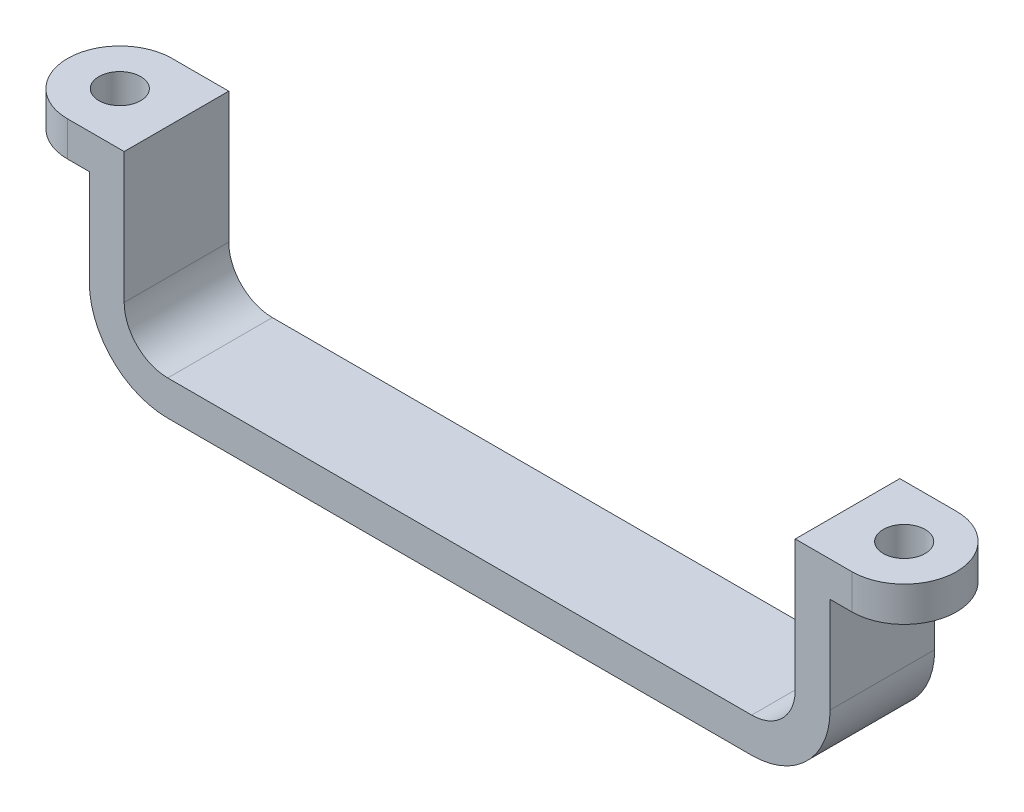
ISO-10303-21;
HEADER;
FILE_DESCRIPTION(('STEP AP214'),'2;1');
FILE_NAME('part.step','',(''),(''),'','','');
FILE_SCHEMA(('AUTOMOTIVE_DESIGN { 1 0 10303 214 1 1 1 1 }'));
ENDSEC;
DATA;
#1=APPLICATION_CONTEXT('core data for automotive mechanical design processes');
#2=APPLICATION_PROTOCOL_DEFINITION('international standard','automotive_design',2000,#1);
#3=PRODUCT_CONTEXT('',#1,'mechanical');
#4=PRODUCT('Part','Part','',(#3));
#5=PRODUCT_RELATED_PRODUCT_CATEGORY('part','',(#4));
#6=PRODUCT_DEFINITION_FORMATION('','',#4);
#7=PRODUCT_DEFINITION_CONTEXT('part definition',#1,'design');
#8=PRODUCT_DEFINITION('design','',#6,#7);
#9=PRODUCT_DEFINITION_SHAPE('','',#8);
#10=(LENGTH_UNIT() NAMED_UNIT(*) SI_UNIT(.MILLI.,.METRE.));
#11=(NAMED_UNIT(*) PLANE_ANGLE_UNIT() SI_UNIT($,.RADIAN.));
#12=(NAMED_UNIT(*) SI_UNIT($,.STERADIAN.) SOLID_ANGLE_UNIT());
#13=UNCERTAINTY_MEASURE_WITH_UNIT(LENGTH_MEASURE(1.E-05),#10,'distance_accuracy_value','');
#14=(GEOMETRIC_REPRESENTATION_CONTEXT(3) GLOBAL_UNCERTAINTY_ASSIGNED_CONTEXT((#13)) GLOBAL_UNIT_ASSIGNED_CONTEXT((#10,
#11,#12)) REPRESENTATION_CONTEXT('',''));
#15=CARTESIAN_POINT('',(0.,0.,0.));
#16=DIRECTION('',(0.,0.,1.));
#17=DIRECTION('',(1.,0.,0.));
#18=AXIS2_PLACEMENT_3D('',#15,#16,#17);
#19=CARTESIAN_POINT('',(21.25,10.,6.));
#20=DIRECTION('',(-1.,0.,0.));
#21=DIRECTION('',(0.,0.,1.));
#22=AXIS2_PLACEMENT_3D('',#19,#20,#21);
#23=PLANE('',#22);
#24=DIRECTION('',(0.,0.,-1.));
#25=VECTOR('',#24,1.);
#26=CARTESIAN_POINT('',(21.25,8.,0.));
#27=LINE('',#26,#25);
#28=CARTESIAN_POINT('',(21.25,8.,6.));
#29=VERTEX_POINT('',#28);
#30=CARTESIAN_POINT('',(21.25,8.,0.));
#31=VERTEX_POINT('',#30);
#32=EDGE_CURVE('E57',#29,#31,#27,.T.);
#33=ORIENTED_EDGE('',*,*,#32,.F.);
#34=DIRECTION('',(0.,1.,0.));
#35=VECTOR('',#34,1.);
#36=CARTESIAN_POINT('',(21.25,10.,6.));
#37=LINE('',#36,#35);
#38=CARTESIAN_POINT('',(21.25,2.5,6.));
#39=VERTEX_POINT('',#38);
#40=EDGE_CURVE('E265',#39,#29,#37,.T.);
#41=ORIENTED_EDGE('',*,*,#40,.F.);
#42=DIRECTION('',(0.,0.,-1.));
#43=VECTOR('',#42,1.);
#44=CARTESIAN_POINT('',(21.25,2.5,6.));
#45=LINE('',#44,#43);
#46=CARTESIAN_POINT('',(21.25,2.5,0.));
#47=VERTEX_POINT('',#46);
#48=EDGE_CURVE('E315',#39,#47,#45,.T.);
#49=ORIENTED_EDGE('',*,*,#48,.T.);
#50=DIRECTION('',(0.,1.,0.));
#51=VECTOR('',#50,1.);
#52=CARTESIAN_POINT('',(21.25,10.,0.));
#53=LINE('',#52,#51);
#54=EDGE_CURVE('E62',#47,#31,#53,.T.);
#55=ORIENTED_EDGE('',*,*,#54,.T.);
#56=EDGE_LOOP('',(#33,#41,#49,#55));
#57=FACE_BOUND('',#56,.T.);
#58=ADVANCED_FACE('F41',(#57),#23,.F.);
#59=CARTESIAN_POINT('',(-21.25,10.,6.));
#60=DIRECTION('',(1.,0.,0.));
#61=DIRECTION('',(0.,0.,-1.));
#62=AXIS2_PLACEMENT_3D('',#59,#60,#61);
#63=PLANE('',#62);
#64=DIRECTION('',(0.,0.,-1.));
#65=VECTOR('',#64,1.);
#66=CARTESIAN_POINT('',(-21.25,8.,0.));
#67=LINE('',#66,#65);
#68=CARTESIAN_POINT('',(-21.25,8.,6.));
#69=VERTEX_POINT('',#68);
#70=CARTESIAN_POINT('',(-21.25,8.,0.));
#71=VERTEX_POINT('',#70);
#72=EDGE_CURVE('E209',#69,#71,#67,.T.);
#73=ORIENTED_EDGE('',*,*,#72,.T.);
#74=DIRECTION('',(0.,-1.,0.));
#75=VECTOR('',#74,1.);
#76=CARTESIAN_POINT('',(-21.25,10.,0.));
#77=LINE('',#76,#75);
#78=CARTESIAN_POINT('',(-21.25,2.5,0.));
#79=VERTEX_POINT('',#78);
#80=EDGE_CURVE('E290',#71,#79,#77,.T.);
#81=ORIENTED_EDGE('',*,*,#80,.T.);
#82=DIRECTION('',(0.,0.,-1.));
#83=VECTOR('',#82,1.);
#84=CARTESIAN_POINT('',(-21.25,2.5,6.));
#85=LINE('',#84,#83);
#86=CARTESIAN_POINT('',(-21.25,2.5,6.));
#87=VERTEX_POINT('',#86);
#88=EDGE_CURVE('E326',#87,#79,#85,.T.);
#89=ORIENTED_EDGE('',*,*,#88,.F.);
#90=DIRECTION('',(0.,-1.,0.));
#91=VECTOR('',#90,1.);
#92=CARTESIAN_POINT('',(-21.25,10.,6.));
#93=LINE('',#92,#91);
#94=EDGE_CURVE('E253',#69,#87,#93,.T.);
#95=ORIENTED_EDGE('',*,*,#94,.F.);
#96=EDGE_LOOP('',(#73,#81,#89,#95));
#97=FACE_BOUND('',#96,.T.);
#98=ADVANCED_FACE('F373',(#97),#63,.F.);
#99=CARTESIAN_POINT('',(16.75,2.5,6.));
#100=DIRECTION('',(0.,0.,-1.));
#101=DIRECTION('',(-1.,0.,0.));
#102=AXIS2_PLACEMENT_3D('',#99,#100,#101);
#103=CYLINDRICAL_SURFACE('',#102,2.5);
#104=CARTESIAN_POINT('',(16.75,2.5,0.));
#105=DIRECTION('',(0.,0.,-1.));
#106=DIRECTION('',(1.,0.,0.));
#107=AXIS2_PLACEMENT_3D('',#104,#105,#106);
#108=CIRCLE('',#107,2.5);
#109=CARTESIAN_POINT('',(19.25,2.5,0.));
#110=VERTEX_POINT('',#109);
#111=CARTESIAN_POINT('',(16.75,0.,0.));
#112=VERTEX_POINT('',#111);
#113=EDGE_CURVE('E232',#110,#112,#108,.T.);
#114=ORIENTED_EDGE('',*,*,#113,.T.);
#115=DIRECTION('',(0.,0.,-1.));
#116=VECTOR('',#115,1.);
#117=CARTESIAN_POINT('',(16.75,0.,6.));
#118=LINE('',#117,#116);
#119=CARTESIAN_POINT('',(16.75,0.,6.));
#120=VERTEX_POINT('',#119);
#121=EDGE_CURVE('E11',#120,#112,#118,.T.);
#122=ORIENTED_EDGE('',*,*,#121,.F.);
#123=CARTESIAN_POINT('',(16.75,2.5,6.));
#124=DIRECTION('',(0.,0.,-1.));
#125=DIRECTION('',(1.,0.,0.));
#126=AXIS2_PLACEMENT_3D('',#123,#124,#125);
#127=CIRCLE('',#126,2.5);
#128=CARTESIAN_POINT('',(19.25,2.5,6.));
#129=VERTEX_POINT('',#128);
#130=EDGE_CURVE('E236',#129,#120,#127,.T.);
#131=ORIENTED_EDGE('',*,*,#130,.F.);
#132=DIRECTION('',(0.,0.,-1.));
#133=VECTOR('',#132,1.);
#134=CARTESIAN_POINT('',(19.25,2.5,6.));
#135=LINE('',#134,#133);
#136=EDGE_CURVE('E274',#129,#110,#135,.T.);
#137=ORIENTED_EDGE('',*,*,#136,.T.);
#138=EDGE_LOOP('',(#114,#122,#131,#137));
#139=FACE_BOUND('',#138,.T.);
#140=ADVANCED_FACE('F43',(#139),#103,.F.);
#141=CARTESIAN_POINT('',(-16.75,0.,6.));
#142=DIRECTION('',(0.,-1.,0.));
#143=DIRECTION('',(0.,0.,-1.));
#144=AXIS2_PLACEMENT_3D('',#141,#142,#143);
#145=PLANE('',#144);
#146=DIRECTION('',(-1.,0.,0.));
#147=VECTOR('',#146,1.);
#148=CARTESIAN_POINT('',(-16.75,0.,0.));
#149=LINE('',#148,#147);
#150=CARTESIAN_POINT('',(-16.75,0.,0.));
#151=VERTEX_POINT('',#150);
#152=EDGE_CURVE('E278',#112,#151,#149,.T.);
#153=ORIENTED_EDGE('',*,*,#152,.T.);
#154=DIRECTION('',(0.,0.,-1.));
#155=VECTOR('',#154,1.);
#156=CARTESIAN_POINT('',(-16.75,0.,6.));
#157=LINE('',#156,#155);
#158=CARTESIAN_POINT('',(-16.75,0.,6.));
#159=VERTEX_POINT('',#158);
#160=EDGE_CURVE('E50',#159,#151,#157,.T.);
#161=ORIENTED_EDGE('',*,*,#160,.F.);
#162=DIRECTION('',(-1.,0.,0.));
#163=VECTOR('',#162,1.);
#164=CARTESIAN_POINT('',(-16.75,0.,6.));
#165=LINE('',#164,#163);
#166=EDGE_CURVE('E240',#120,#159,#165,.T.);
#167=ORIENTED_EDGE('',*,*,#166,.F.);
#168=ORIENTED_EDGE('',*,*,#121,.T.);
#169=EDGE_LOOP('',(#153,#161,#167,#168));
#170=FACE_BOUND('',#169,.T.);
#171=ADVANCED_FACE('F408',(#170),#145,.F.);
#172=CARTESIAN_POINT('',(-16.75,2.5,6.));
#173=DIRECTION('',(0.,0.,-1.));
#174=DIRECTION('',(-1.,0.,0.));
#175=AXIS2_PLACEMENT_3D('',#172,#173,#174);
#176=CYLINDRICAL_SURFACE('',#175,2.5);
#177=CARTESIAN_POINT('',(-16.75,2.5,0.));
#178=DIRECTION('',(0.,0.,-1.));
#179=DIRECTION('',(1.,0.,0.));
#180=AXIS2_PLACEMENT_3D('',#177,#178,#179);
#181=CIRCLE('',#180,2.5);
#182=CARTESIAN_POINT('',(-19.25,2.5,0.));
#183=VERTEX_POINT('',#182);
#184=EDGE_CURVE('E281',#151,#183,#181,.T.);
#185=ORIENTED_EDGE('',*,*,#184,.T.);
#186=DIRECTION('',(0.,0.,-1.));
#187=VECTOR('',#186,1.);
#188=CARTESIAN_POINT('',(-19.25,2.5,6.));
#189=LINE('',#188,#187);
#190=CARTESIAN_POINT('',(-19.25,2.5,6.));
#191=VERTEX_POINT('',#190);
#192=EDGE_CURVE('E334',#191,#183,#189,.T.);
#193=ORIENTED_EDGE('',*,*,#192,.F.);
#194=CARTESIAN_POINT('',(-16.75,2.5,6.));
#195=DIRECTION('',(0.,0.,-1.));
#196=DIRECTION('',(1.,0.,0.));
#197=AXIS2_PLACEMENT_3D('',#194,#195,#196);
#198=CIRCLE('',#197,2.5);
#199=EDGE_CURVE('E244',#159,#191,#198,.T.);
#200=ORIENTED_EDGE('',*,*,#199,.F.);
#201=ORIENTED_EDGE('',*,*,#160,.T.);
#202=EDGE_LOOP('',(#185,#193,#200,#201));
#203=FACE_BOUND('',#202,.T.);
#204=ADVANCED_FACE('F343',(#203),#176,.F.);
#205=CARTESIAN_POINT('',(-19.25,10.,6.));
#206=DIRECTION('',(-1.,0.,0.));
#207=DIRECTION('',(0.,-1.,0.));
#208=AXIS2_PLACEMENT_3D('',#205,#206,#207);
#209=PLANE('',#208);
#210=DIRECTION('',(0.,1.,0.));
#211=VECTOR('',#210,1.);
#212=CARTESIAN_POINT('',(-19.25,10.,0.));
#213=LINE('',#212,#211);
#214=CARTESIAN_POINT('',(-19.25,10.,0.));
#215=VERTEX_POINT('',#214);
#216=EDGE_CURVE('E284',#183,#215,#213,.T.);
#217=ORIENTED_EDGE('',*,*,#216,.T.);
#218=DIRECTION('',(0.,0.,-1.));
#219=VECTOR('',#218,1.);
#220=CARTESIAN_POINT('',(-19.25,10.,6.));
#221=LINE('',#220,#219);
#222=CARTESIAN_POINT('',(-19.25,10.,6.));
#223=VERTEX_POINT('',#222);
#224=EDGE_CURVE('E330',#223,#215,#221,.T.);
#225=ORIENTED_EDGE('',*,*,#224,.F.);
#226=DIRECTION('',(0.,1.,0.));
#227=VECTOR('',#226,1.);
#228=CARTESIAN_POINT('',(-19.25,10.,6.));
#229=LINE('',#228,#227);
#230=EDGE_CURVE('E247',#191,#223,#229,.T.);
#231=ORIENTED_EDGE('',*,*,#230,.F.);
#232=ORIENTED_EDGE('',*,*,#192,.T.);
#233=EDGE_LOOP('',(#217,#225,#231,#232));
#234=FACE_BOUND('',#233,.T.);
#235=ADVANCED_FACE('F350',(#234),#209,.F.);
#236=CARTESIAN_POINT('',(-21.25,10.,6.));
#237=DIRECTION('',(0.,-1.,0.));
#238=DIRECTION('',(0.,0.,-1.));
#239=AXIS2_PLACEMENT_3D('',#236,#237,#238);
#240=PLANE('',#239);
#241=DIRECTION('',(-1.,0.,0.));
#242=VECTOR('',#241,1.);
#243=CARTESIAN_POINT('',(-21.25,10.,0.));
#244=LINE('',#243,#242);
#245=CARTESIAN_POINT('',(-22.5,10.,0.));
#246=VERTEX_POINT('',#245);
#247=EDGE_CURVE('E287',#215,#246,#244,.T.);
#248=ORIENTED_EDGE('',*,*,#247,.T.);
#249=CARTESIAN_POINT('',(-22.5,10.,3.));
#250=DIRECTION('',(0.,1.,0.));
#251=DIRECTION('',(0.,0.,1.));
#252=AXIS2_PLACEMENT_3D('',#249,#250,#251);
#253=CIRCLE('',#252,3.00000000000005);
#254=CARTESIAN_POINT('',(-22.5,10.,6.00000000000002));
#255=VERTEX_POINT('',#254);
#256=EDGE_CURVE('E199',#255,#246,#253,.F.);
#257=ORIENTED_EDGE('',*,*,#256,.F.);
#258=DIRECTION('',(-1.,0.,0.));
#259=VECTOR('',#258,1.);
#260=CARTESIAN_POINT('',(-21.25,10.,6.));
#261=LINE('',#260,#259);
#262=EDGE_CURVE('E250',#223,#255,#261,.T.);
#263=ORIENTED_EDGE('',*,*,#262,.F.);
#264=ORIENTED_EDGE('',*,*,#224,.T.);
#265=EDGE_LOOP('',(#248,#257,#263,#264));
#266=FACE_BOUND('',#265,.T.);
#267=CARTESIAN_POINT('',(-22.5,10.,3.));
#268=DIRECTION('',(0.,1.,0.));
#269=DIRECTION('',(0.,0.,1.));
#270=AXIS2_PLACEMENT_3D('',#267,#268,#269);
#271=CIRCLE('',#270,1.2);
#272=CARTESIAN_POINT('',(-22.5,10.,4.2));
#273=VERTEX_POINT('',#272);
#274=EDGE_CURVE('E206',#273,#273,#271,.F.);
#275=ORIENTED_EDGE('',*,*,#274,.T.);
#276=EDGE_LOOP('',(#275));
#277=FACE_BOUND('',#276,.T.);
#278=ADVANCED_FACE('F354',(#266,#277),#240,.F.);
#279=CARTESIAN_POINT('',(-16.75,2.5,6.));
#280=DIRECTION('',(0.,0.,-1.));
#281=DIRECTION('',(-1.,0.,0.));
#282=AXIS2_PLACEMENT_3D('',#279,#280,#281);
#283=CYLINDRICAL_SURFACE('',#282,4.5);
#284=CARTESIAN_POINT('',(-16.75,2.5,0.));
#285=DIRECTION('',(0.,0.,1.));
#286=DIRECTION('',(1.,0.,0.));
#287=AXIS2_PLACEMENT_3D('',#284,#285,#286);
#288=CIRCLE('',#287,4.5);
#289=CARTESIAN_POINT('',(-16.75,-2.,0.));
#290=VERTEX_POINT('',#289);
#291=EDGE_CURVE('E293',#79,#290,#288,.T.);
#292=ORIENTED_EDGE('',*,*,#291,.T.);
#293=DIRECTION('',(0.,0.,-1.));
#294=VECTOR('',#293,1.);
#295=CARTESIAN_POINT('',(-16.75,-2.,6.));
#296=LINE('',#295,#294);
#297=CARTESIAN_POINT('',(-16.75,-2.,6.));
#298=VERTEX_POINT('',#297);
#299=EDGE_CURVE('E322',#298,#290,#296,.T.);
#300=ORIENTED_EDGE('',*,*,#299,.F.);
#301=CARTESIAN_POINT('',(-16.75,2.5,6.));
#302=DIRECTION('',(0.,0.,1.));
#303=DIRECTION('',(1.,0.,0.));
#304=AXIS2_PLACEMENT_3D('',#301,#302,#303);
#305=CIRCLE('',#304,4.5);
#306=EDGE_CURVE('E256',#87,#298,#305,.T.);
#307=ORIENTED_EDGE('',*,*,#306,.F.);
#308=ORIENTED_EDGE('',*,*,#88,.T.);
#309=EDGE_LOOP('',(#292,#300,#307,#308));
#310=FACE_BOUND('',#309,.T.);
#311=ADVANCED_FACE('F376',(#310),#283,.T.);
#312=CARTESIAN_POINT('',(-16.75,-2.,6.));
#313=DIRECTION('',(0.,1.,0.));
#314=DIRECTION('',(0.,0.,1.));
#315=AXIS2_PLACEMENT_3D('',#312,#313,#314);
#316=PLANE('',#315);
#317=DIRECTION('',(1.,0.,0.));
#318=VECTOR('',#317,1.);
#319=CARTESIAN_POINT('',(-16.75,-2.,0.));
#320=LINE('',#319,#318);
#321=CARTESIAN_POINT('',(16.75,-2.,0.));
#322=VERTEX_POINT('',#321);
#323=EDGE_CURVE('E296',#290,#322,#320,.T.);
#324=ORIENTED_EDGE('',*,*,#323,.T.);
#325=DIRECTION('',(0.,0.,-1.));
#326=VECTOR('',#325,1.);
#327=CARTESIAN_POINT('',(16.75,-2.,6.));
#328=LINE('',#327,#326);
#329=CARTESIAN_POINT('',(16.75,-2.,6.));
#330=VERTEX_POINT('',#329);
#331=EDGE_CURVE('E318',#330,#322,#328,.T.);
#332=ORIENTED_EDGE('',*,*,#331,.F.);
#333=DIRECTION('',(1.,0.,0.));
#334=VECTOR('',#333,1.);
#335=CARTESIAN_POINT('',(-16.75,-2.,6.));
#336=LINE('',#335,#334);
#337=EDGE_CURVE('E259',#298,#330,#336,.T.);
#338=ORIENTED_EDGE('',*,*,#337,.F.);
#339=ORIENTED_EDGE('',*,*,#299,.T.);
#340=EDGE_LOOP('',(#324,#332,#338,#339));
#341=FACE_BOUND('',#340,.T.);
#342=ADVANCED_FACE('F381',(#341),#316,.F.);
#343=CARTESIAN_POINT('',(16.75,2.5,6.));
#344=DIRECTION('',(0.,0.,-1.));
#345=DIRECTION('',(-1.,0.,0.));
#346=AXIS2_PLACEMENT_3D('',#343,#344,#345);
#347=CYLINDRICAL_SURFACE('',#346,4.5);
#348=CARTESIAN_POINT('',(16.75,2.5,0.));
#349=DIRECTION('',(0.,0.,1.));
#350=DIRECTION('',(1.,0.,0.));
#351=AXIS2_PLACEMENT_3D('',#348,#349,#350);
#352=CIRCLE('',#351,4.5);
#353=EDGE_CURVE('E299',#322,#47,#352,.T.);
#354=ORIENTED_EDGE('',*,*,#353,.T.);
#355=ORIENTED_EDGE('',*,*,#48,.F.);
#356=CARTESIAN_POINT('',(16.75,2.5,6.));
#357=DIRECTION('',(0.,0.,1.));
#358=DIRECTION('',(1.,0.,0.));
#359=AXIS2_PLACEMENT_3D('',#356,#357,#358);
#360=CIRCLE('',#359,4.5);
#361=EDGE_CURVE('E262',#330,#39,#360,.T.);
#362=ORIENTED_EDGE('',*,*,#361,.F.);
#363=ORIENTED_EDGE('',*,*,#331,.T.);
#364=EDGE_LOOP('',(#354,#355,#362,#363));
#365=FACE_BOUND('',#364,.T.);
#366=ADVANCED_FACE('F385',(#365),#347,.T.);
#367=CARTESIAN_POINT('',(19.25,10.,6.));
#368=DIRECTION('',(0.,-1.,0.));
#369=DIRECTION('',(0.,0.,-1.));
#370=AXIS2_PLACEMENT_3D('',#367,#368,#369);
#371=PLANE('',#370);
#372=DIRECTION('',(-1.,0.,0.));
#373=VECTOR('',#372,1.);
#374=CARTESIAN_POINT('',(19.25,10.,0.));
#375=LINE('',#374,#373);
#376=CARTESIAN_POINT('',(22.5,10.,0.));
#377=VERTEX_POINT('',#376);
#378=CARTESIAN_POINT('',(19.25,10.,0.));
#379=VERTEX_POINT('',#378);
#380=EDGE_CURVE('E169',#377,#379,#375,.T.);
#381=ORIENTED_EDGE('',*,*,#380,.T.);
#382=DIRECTION('',(0.,0.,-1.));
#383=VECTOR('',#382,1.);
#384=CARTESIAN_POINT('',(19.25,10.,6.));
#385=LINE('',#384,#383);
#386=CARTESIAN_POINT('',(19.25,10.,6.));
#387=VERTEX_POINT('',#386);
#388=EDGE_CURVE('E311',#387,#379,#385,.T.);
#389=ORIENTED_EDGE('',*,*,#388,.F.);
#390=DIRECTION('',(-1.,0.,0.));
#391=VECTOR('',#390,1.);
#392=CARTESIAN_POINT('',(19.25,10.,6.));
#393=LINE('',#392,#391);
#394=CARTESIAN_POINT('',(22.5,10.,6.));
#395=VERTEX_POINT('',#394);
#396=EDGE_CURVE('E268',#395,#387,#393,.T.);
#397=ORIENTED_EDGE('',*,*,#396,.F.);
#398=CARTESIAN_POINT('',(22.5,10.,3.));
#399=DIRECTION('',(0.,1.,0.));
#400=DIRECTION('',(0.,0.,1.));
#401=AXIS2_PLACEMENT_3D('',#398,#399,#400);
#402=CIRCLE('',#401,3.);
#403=EDGE_CURVE('E185',#395,#377,#402,.T.);
#404=ORIENTED_EDGE('',*,*,#403,.T.);
#405=EDGE_LOOP('',(#381,#389,#397,#404));
#406=FACE_BOUND('',#405,.T.);
#407=CARTESIAN_POINT('',(22.5,10.,3.));
#408=DIRECTION('',(0.,1.,0.));
#409=DIRECTION('',(0.,0.,1.));
#410=AXIS2_PLACEMENT_3D('',#407,#408,#409);
#411=CIRCLE('',#410,1.2);
#412=CARTESIAN_POINT('',(22.5,10.,4.2));
#413=VERTEX_POINT('',#412);
#414=EDGE_CURVE('E192',#413,#413,#411,.T.);
#415=ORIENTED_EDGE('',*,*,#414,.F.);
#416=EDGE_LOOP('',(#415));
#417=FACE_BOUND('',#416,.T.);
#418=ADVANCED_FACE('F395',(#406,#417),#371,.F.);
#419=CARTESIAN_POINT('',(19.25,10.,6.));
#420=DIRECTION('',(1.,0.,0.));
#421=DIRECTION('',(0.,1.,0.));
#422=AXIS2_PLACEMENT_3D('',#419,#420,#421);
#423=PLANE('',#422);
#424=DIRECTION('',(0.,-1.,0.));
#425=VECTOR('',#424,1.);
#426=CARTESIAN_POINT('',(19.25,10.,0.));
#427=LINE('',#426,#425);
#428=EDGE_CURVE('E241',#379,#110,#427,.T.);
#429=ORIENTED_EDGE('',*,*,#428,.T.);
#430=ORIENTED_EDGE('',*,*,#136,.F.);
#431=DIRECTION('',(0.,-1.,0.));
#432=VECTOR('',#431,1.);
#433=CARTESIAN_POINT('',(19.25,10.,6.));
#434=LINE('',#433,#432);
#435=EDGE_CURVE('E271',#387,#129,#434,.T.);
#436=ORIENTED_EDGE('',*,*,#435,.F.);
#437=ORIENTED_EDGE('',*,*,#388,.T.);
#438=EDGE_LOOP('',(#429,#430,#436,#437));
#439=FACE_BOUND('',#438,.T.);
#440=ADVANCED_FACE('F418',(#439),#423,.F.);
#441=CARTESIAN_POINT('',(16.75,2.5,6.));
#442=DIRECTION('',(0.,0.,1.));
#443=DIRECTION('',(1.,0.,0.));
#444=AXIS2_PLACEMENT_3D('',#441,#442,#443);
#445=PLANE('',#444);
#446=ORIENTED_EDGE('',*,*,#130,.T.);
#447=ORIENTED_EDGE('',*,*,#166,.T.);
#448=ORIENTED_EDGE('',*,*,#199,.T.);
#449=ORIENTED_EDGE('',*,*,#230,.T.);
#450=ORIENTED_EDGE('',*,*,#262,.T.);
#451=DIRECTION('',(0.,1.,0.));
#452=VECTOR('',#451,1.);
#453=CARTESIAN_POINT('',(-22.5,8.,6.00000000000002));
#454=LINE('',#453,#452);
#455=CARTESIAN_POINT('',(-22.5,8.,6.00000000000002));
#456=VERTEX_POINT('',#455);
#457=EDGE_CURVE('E221',#456,#255,#454,.T.);
#458=ORIENTED_EDGE('',*,*,#457,.F.);
#459=DIRECTION('',(-1.,0.,0.));
#460=VECTOR('',#459,1.);
#461=CARTESIAN_POINT('',(0.,8.,6.));
#462=LINE('',#461,#460);
#463=EDGE_CURVE('E205',#69,#456,#462,.T.);
#464=ORIENTED_EDGE('',*,*,#463,.F.);
#465=ORIENTED_EDGE('',*,*,#94,.T.);
#466=ORIENTED_EDGE('',*,*,#306,.T.);
#467=ORIENTED_EDGE('',*,*,#337,.T.);
#468=ORIENTED_EDGE('',*,*,#361,.T.);
#469=ORIENTED_EDGE('',*,*,#40,.T.);
#470=DIRECTION('',(-1.,0.,0.));
#471=VECTOR('',#470,1.);
#472=CARTESIAN_POINT('',(0.,8.,6.));
#473=LINE('',#472,#471);
#474=CARTESIAN_POINT('',(22.5,8.,6.));
#475=VERTEX_POINT('',#474);
#476=EDGE_CURVE('E175',#475,#29,#473,.T.);
#477=ORIENTED_EDGE('',*,*,#476,.F.);
#478=DIRECTION('',(0.,1.,0.));
#479=VECTOR('',#478,1.);
#480=CARTESIAN_POINT('',(22.5,8.,6.));
#481=LINE('',#480,#479);
#482=EDGE_CURVE('E174',#475,#395,#481,.T.);
#483=ORIENTED_EDGE('',*,*,#482,.T.);
#484=ORIENTED_EDGE('',*,*,#396,.T.);
#485=ORIENTED_EDGE('',*,*,#435,.T.);
#486=EDGE_LOOP('',(#446,#447,#448,#449,#450,#458,#464,#465,#466,#467,#468,#469,#477,#483,#484,#485));
#487=FACE_BOUND('',#486,.T.);
#488=ADVANCED_FACE('F359',(#487),#445,.T.);
#489=CARTESIAN_POINT('',(16.75,2.5,0.));
#490=DIRECTION('',(0.,0.,1.));
#491=DIRECTION('',(1.,0.,0.));
#492=AXIS2_PLACEMENT_3D('',#489,#490,#491);
#493=PLANE('',#492);
#494=ORIENTED_EDGE('',*,*,#113,.F.);
#495=ORIENTED_EDGE('',*,*,#428,.F.);
#496=ORIENTED_EDGE('',*,*,#380,.F.);
#497=DIRECTION('',(0.,1.,0.));
#498=VECTOR('',#497,1.);
#499=CARTESIAN_POINT('',(22.5,8.,0.));
#500=LINE('',#499,#498);
#501=CARTESIAN_POINT('',(22.5,8.,0.));
#502=VERTEX_POINT('',#501);
#503=EDGE_CURVE('E165',#502,#377,#500,.T.);
#504=ORIENTED_EDGE('',*,*,#503,.F.);
#505=DIRECTION('',(1.,0.,0.));
#506=VECTOR('',#505,1.);
#507=CARTESIAN_POINT('',(0.,8.,0.));
#508=LINE('',#507,#506);
#509=EDGE_CURVE('E155',#31,#502,#508,.T.);
#510=ORIENTED_EDGE('',*,*,#509,.F.);
#511=ORIENTED_EDGE('',*,*,#54,.F.);
#512=ORIENTED_EDGE('',*,*,#353,.F.);
#513=ORIENTED_EDGE('',*,*,#323,.F.);
#514=ORIENTED_EDGE('',*,*,#291,.F.);
#515=ORIENTED_EDGE('',*,*,#80,.F.);
#516=DIRECTION('',(1.,0.,0.));
#517=VECTOR('',#516,1.);
#518=CARTESIAN_POINT('',(0.,8.,0.));
#519=LINE('',#518,#517);
#520=CARTESIAN_POINT('',(-22.5,8.,0.));
#521=VERTEX_POINT('',#520);
#522=EDGE_CURVE('E213',#521,#71,#519,.T.);
#523=ORIENTED_EDGE('',*,*,#522,.F.);
#524=DIRECTION('',(0.,1.,0.));
#525=VECTOR('',#524,1.);
#526=CARTESIAN_POINT('',(-22.5,8.,0.));
#527=LINE('',#526,#525);
#528=EDGE_CURVE('E228',#521,#246,#527,.T.);
#529=ORIENTED_EDGE('',*,*,#528,.T.);
#530=ORIENTED_EDGE('',*,*,#247,.F.);
#531=ORIENTED_EDGE('',*,*,#216,.F.);
#532=ORIENTED_EDGE('',*,*,#184,.F.);
#533=ORIENTED_EDGE('',*,*,#152,.F.);
#534=EDGE_LOOP('',(#494,#495,#496,#504,#510,#511,#512,#513,#514,#515,#523,#529,#530,#531,#532,#533));
#535=FACE_BOUND('',#534,.T.);
#536=ADVANCED_FACE('F167',(#535),#493,.F.);
#537=CARTESIAN_POINT('',(-22.5,8.,3.));
#538=DIRECTION('',(0.,1.,0.));
#539=DIRECTION('',(0.,0.,1.));
#540=AXIS2_PLACEMENT_3D('',#537,#538,#539);
#541=CYLINDRICAL_SURFACE('',#540,3.00000000000005);
#542=ORIENTED_EDGE('',*,*,#256,.T.);
#543=ORIENTED_EDGE('',*,*,#528,.F.);
#544=CARTESIAN_POINT('',(-22.5,8.,3.));
#545=DIRECTION('',(0.,1.,0.));
#546=DIRECTION('',(0.,0.,1.));
#547=AXIS2_PLACEMENT_3D('',#544,#545,#546);
#548=CIRCLE('',#547,3.00000000000005);
#549=EDGE_CURVE('E201',#456,#521,#548,.F.);
#550=ORIENTED_EDGE('',*,*,#549,.F.);
#551=ORIENTED_EDGE('',*,*,#457,.T.);
#552=EDGE_LOOP('',(#542,#543,#550,#551));
#553=FACE_BOUND('',#552,.T.);
#554=ADVANCED_FACE('F363',(#553),#541,.T.);
#555=CARTESIAN_POINT('',(-22.5,8.,3.));
#556=DIRECTION('',(0.,1.,0.));
#557=DIRECTION('',(0.,0.,1.));
#558=AXIS2_PLACEMENT_3D('',#555,#556,#557);
#559=CYLINDRICAL_SURFACE('',#558,1.2);
#560=CARTESIAN_POINT('',(-22.5,8.,3.));
#561=DIRECTION('',(0.,1.,0.));
#562=DIRECTION('',(0.,0.,1.));
#563=AXIS2_PLACEMENT_3D('',#560,#561,#562);
#564=CIRCLE('',#563,1.2);
#565=CARTESIAN_POINT('',(-22.5,8.,4.2));
#566=VERTEX_POINT('',#565);
#567=EDGE_CURVE('E217',#566,#566,#564,.F.);
#568=ORIENTED_EDGE('',*,*,#567,.T.);
#569=EDGE_LOOP('',(#568));
#570=FACE_BOUND('',#569,.T.);
#571=ORIENTED_EDGE('',*,*,#274,.F.);
#572=EDGE_LOOP('',(#571));
#573=FACE_BOUND('',#572,.T.);
#574=ADVANCED_FACE('F441',(#570,#573),#559,.F.);
#575=CARTESIAN_POINT('',(0.,8.,0.));
#576=DIRECTION('',(0.,1.,0.));
#577=DIRECTION('',(0.,0.,1.));
#578=AXIS2_PLACEMENT_3D('',#575,#576,#577);
#579=PLANE('',#578);
#580=ORIENTED_EDGE('',*,*,#549,.T.);
#581=ORIENTED_EDGE('',*,*,#522,.T.);
#582=ORIENTED_EDGE('',*,*,#72,.F.);
#583=ORIENTED_EDGE('',*,*,#463,.T.);
#584=EDGE_LOOP('',(#580,#581,#582,#583));
#585=FACE_BOUND('',#584,.T.);
#586=ORIENTED_EDGE('',*,*,#567,.F.);
#587=EDGE_LOOP('',(#586));
#588=FACE_BOUND('',#587,.T.);
#589=ADVANCED_FACE('F366',(#585,#588),#579,.F.);
#590=CARTESIAN_POINT('',(22.5,8.,3.));
#591=DIRECTION('',(0.,1.,0.));
#592=DIRECTION('',(0.,0.,1.));
#593=AXIS2_PLACEMENT_3D('',#590,#591,#592);
#594=CYLINDRICAL_SURFACE('',#593,3.);
#595=ORIENTED_EDGE('',*,*,#403,.F.);
#596=ORIENTED_EDGE('',*,*,#482,.F.);
#597=CARTESIAN_POINT('',(22.5,8.,3.));
#598=DIRECTION('',(0.,1.,0.));
#599=DIRECTION('',(0.,0.,1.));
#600=AXIS2_PLACEMENT_3D('',#597,#598,#599);
#601=CIRCLE('',#600,3.);
#602=EDGE_CURVE('E160',#475,#502,#601,.T.);
#603=ORIENTED_EDGE('',*,*,#602,.T.);
#604=ORIENTED_EDGE('',*,*,#503,.T.);
#605=EDGE_LOOP('',(#595,#596,#603,#604));
#606=FACE_BOUND('',#605,.T.);
#607=ADVANCED_FACE('F177',(#606),#594,.T.);
#608=CARTESIAN_POINT('',(22.5,8.,3.));
#609=DIRECTION('',(0.,1.,0.));
#610=DIRECTION('',(0.,0.,1.));
#611=AXIS2_PLACEMENT_3D('',#608,#609,#610);
#612=CYLINDRICAL_SURFACE('',#611,1.2);
#613=CARTESIAN_POINT('',(22.5,8.,3.));
#614=DIRECTION('',(0.,1.,0.));
#615=DIRECTION('',(0.,0.,1.));
#616=AXIS2_PLACEMENT_3D('',#613,#614,#615);
#617=CIRCLE('',#616,1.2);
#618=CARTESIAN_POINT('',(22.5,8.,4.2));
#619=VERTEX_POINT('',#618);
#620=EDGE_CURVE('E181',#619,#619,#617,.T.);
#621=ORIENTED_EDGE('',*,*,#620,.F.);
#622=EDGE_LOOP('',(#621));
#623=FACE_BOUND('',#622,.T.);
#624=ORIENTED_EDGE('',*,*,#414,.T.);
#625=EDGE_LOOP('',(#624));
#626=FACE_BOUND('',#625,.T.);
#627=ADVANCED_FACE('F426',(#623,#626),#612,.F.);
#628=CARTESIAN_POINT('',(0.,8.,0.));
#629=DIRECTION('',(0.,1.,0.));
#630=DIRECTION('',(0.,0.,1.));
#631=AXIS2_PLACEMENT_3D('',#628,#629,#630);
#632=PLANE('',#631);
#633=ORIENTED_EDGE('',*,*,#620,.T.);
#634=EDGE_LOOP('',(#633));
#635=FACE_BOUND('',#634,.T.);
#636=ORIENTED_EDGE('',*,*,#602,.F.);
#637=ORIENTED_EDGE('',*,*,#476,.T.);
#638=ORIENTED_EDGE('',*,*,#32,.T.);
#639=ORIENTED_EDGE('',*,*,#509,.T.);
#640=EDGE_LOOP('',(#636,#637,#638,#639));
#641=FACE_BOUND('',#640,.T.);
#642=ADVANCED_FACE('F157',(#635,#641),#632,.F.);
#643=CLOSED_SHELL('',(#58,#98,#140,#171,#204,#235,#278,#311,#342,#366,#418,#440,#488,#536,#554,
#574,#589,#607,#627,#642));
#644=MANIFOLD_SOLID_BREP('B2',#643);
#645=ADVANCED_BREP_SHAPE_REPRESENTATION('',(#18,#644),#14);
#646=SHAPE_DEFINITION_REPRESENTATION(#9,#645);
ENDSEC;
END-ISO-10303-21;
